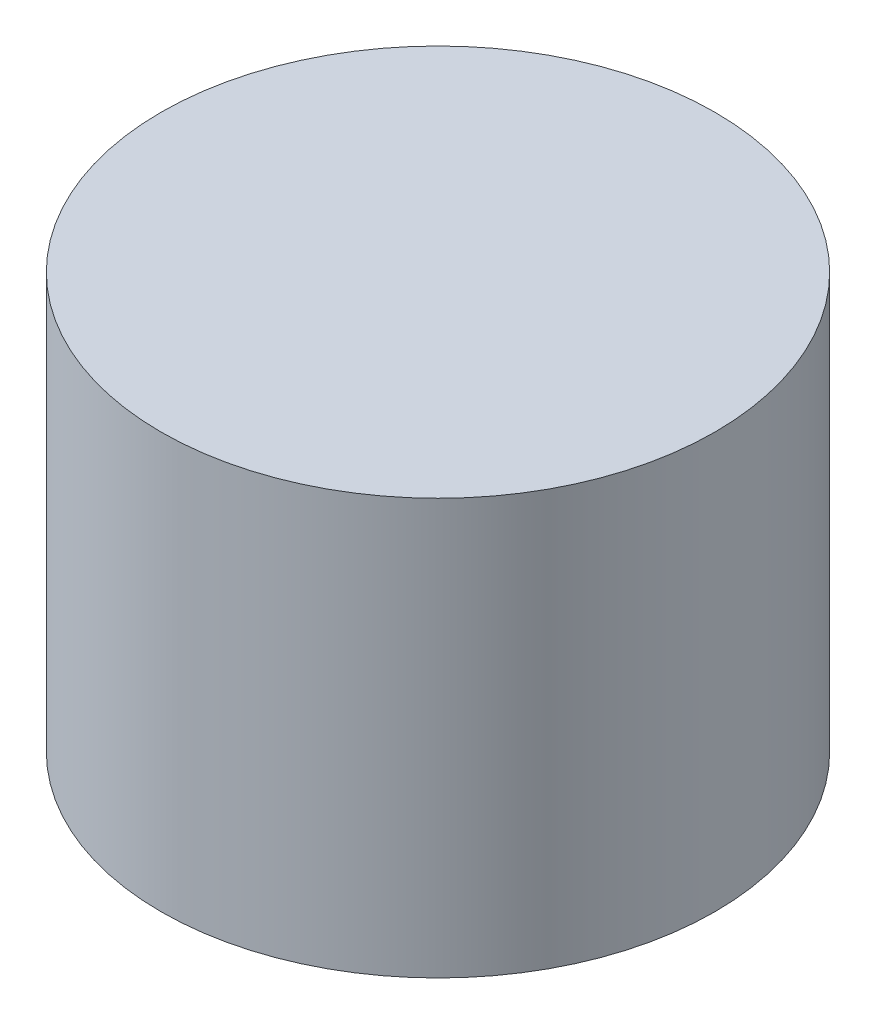
ISO-10303-21;
HEADER;
FILE_DESCRIPTION(('STEP AP214'),'2;1');
FILE_NAME('part.step','',(''),(''),'','','');
FILE_SCHEMA(('AUTOMOTIVE_DESIGN { 1 0 10303 214 1 1 1 1 }'));
ENDSEC;
DATA;
#1=APPLICATION_CONTEXT('core data for automotive mechanical design processes');
#2=APPLICATION_PROTOCOL_DEFINITION('international standard','automotive_design',2000,#1);
#3=PRODUCT_CONTEXT('',#1,'mechanical');
#4=PRODUCT('Part','Part','',(#3));
#5=PRODUCT_RELATED_PRODUCT_CATEGORY('part','',(#4));
#6=PRODUCT_DEFINITION_FORMATION('','',#4);
#7=PRODUCT_DEFINITION_CONTEXT('part definition',#1,'design');
#8=PRODUCT_DEFINITION('design','',#6,#7);
#9=PRODUCT_DEFINITION_SHAPE('','',#8);
#10=(LENGTH_UNIT() NAMED_UNIT(*) SI_UNIT(.MILLI.,.METRE.));
#11=(NAMED_UNIT(*) PLANE_ANGLE_UNIT() SI_UNIT($,.RADIAN.));
#12=(NAMED_UNIT(*) SI_UNIT($,.STERADIAN.) SOLID_ANGLE_UNIT());
#13=UNCERTAINTY_MEASURE_WITH_UNIT(LENGTH_MEASURE(1.E-05),#10,'distance_accuracy_value','');
#14=(GEOMETRIC_REPRESENTATION_CONTEXT(3) GLOBAL_UNCERTAINTY_ASSIGNED_CONTEXT((#13)) GLOBAL_UNIT_ASSIGNED_CONTEXT((#10,
#11,#12)) REPRESENTATION_CONTEXT('',''));
#15=CARTESIAN_POINT('',(0.,0.,0.));
#16=DIRECTION('',(0.,0.,1.));
#17=DIRECTION('',(1.,0.,0.));
#18=AXIS2_PLACEMENT_3D('',#15,#16,#17);
#19=CARTESIAN_POINT('',(0.,15.,0.));
#20=DIRECTION('',(0.,-1.,0.));
#21=DIRECTION('',(0.,0.,-1.));
#22=AXIS2_PLACEMENT_3D('',#19,#20,#21);
#23=CYLINDRICAL_SURFACE('',#22,10.);
#24=CARTESIAN_POINT('',(0.,15.,0.));
#25=DIRECTION('',(0.,1.,0.));
#26=DIRECTION('',(0.,0.,1.));
#27=AXIS2_PLACEMENT_3D('',#24,#25,#26);
#28=CIRCLE('',#27,10.);
#29=CARTESIAN_POINT('',(0.,15.,10.));
#30=VERTEX_POINT('',#29);
#31=EDGE_CURVE('E10',#30,#30,#28,.T.);
#32=ORIENTED_EDGE('',*,*,#31,.F.);
#33=EDGE_LOOP('',(#32));
#34=FACE_BOUND('',#33,.T.);
#35=CARTESIAN_POINT('',(0.,0.,0.));
#36=DIRECTION('',(0.,1.,0.));
#37=DIRECTION('',(0.,0.,1.));
#38=AXIS2_PLACEMENT_3D('',#35,#36,#37);
#39=CIRCLE('',#38,10.);
#40=CARTESIAN_POINT('',(0.,0.,10.));
#41=VERTEX_POINT('',#40);
#42=EDGE_CURVE('E46',#41,#41,#39,.T.);
#43=ORIENTED_EDGE('',*,*,#42,.T.);
#44=EDGE_LOOP('',(#43));
#45=FACE_BOUND('',#44,.T.);
#46=ADVANCED_FACE('F43',(#34,#45),#23,.T.);
#47=CARTESIAN_POINT('',(0.,15.,0.));
#48=DIRECTION('',(0.,1.,0.));
#49=DIRECTION('',(0.,0.,1.));
#50=AXIS2_PLACEMENT_3D('',#47,#48,#49);
#51=PLANE('',#50);
#52=ORIENTED_EDGE('',*,*,#31,.T.);
#53=EDGE_LOOP('',(#52));
#54=FACE_BOUND('',#53,.T.);
#55=ADVANCED_FACE('F60',(#54),#51,.T.);
#56=CARTESIAN_POINT('',(0.,0.,0.));
#57=DIRECTION('',(0.,1.,0.));
#58=DIRECTION('',(0.,0.,1.));
#59=AXIS2_PLACEMENT_3D('',#56,#57,#58);
#60=PLANE('',#59);
#61=ORIENTED_EDGE('',*,*,#42,.F.);
#62=EDGE_LOOP('',(#61));
#63=FACE_BOUND('',#62,.T.);
#64=ADVANCED_FACE('F58',(#63),#60,.F.);
#65=CLOSED_SHELL('',(#46,#55,#64));
#66=MANIFOLD_SOLID_BREP('B2',#65);
#67=ADVANCED_BREP_SHAPE_REPRESENTATION('',(#18,#66),#14);
#68=SHAPE_DEFINITION_REPRESENTATION(#9,#67);
ENDSEC;
END-ISO-10303-21;
